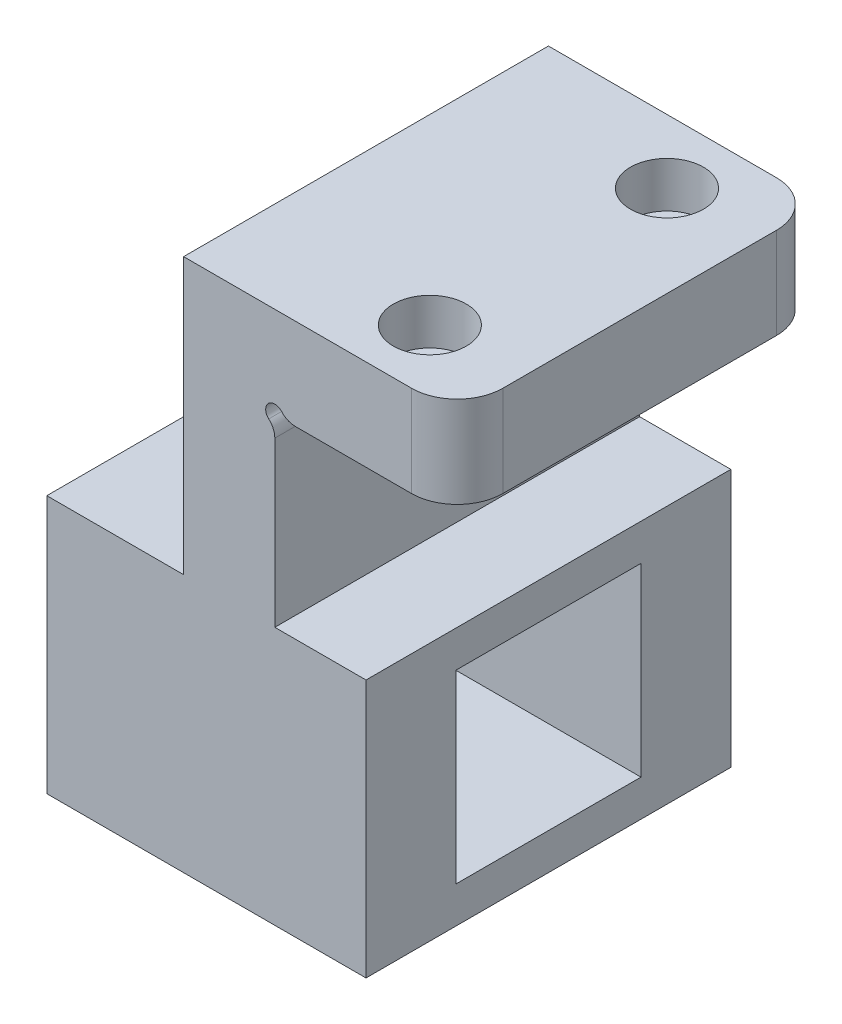
ISO-10303-21;
HEADER;
FILE_DESCRIPTION(('STEP AP214'),'2;1');
FILE_NAME('part.step','',(''),(''),'','','');
FILE_SCHEMA(('AUTOMOTIVE_DESIGN { 1 0 10303 214 1 1 1 1 }'));
ENDSEC;
DATA;
#1=APPLICATION_CONTEXT('core data for automotive mechanical design processes');
#2=APPLICATION_PROTOCOL_DEFINITION('international standard','automotive_design',2000,#1);
#3=PRODUCT_CONTEXT('',#1,'mechanical');
#4=PRODUCT('Part','Part','',(#3));
#5=PRODUCT_RELATED_PRODUCT_CATEGORY('part','',(#4));
#6=PRODUCT_DEFINITION_FORMATION('','',#4);
#7=PRODUCT_DEFINITION_CONTEXT('part definition',#1,'design');
#8=PRODUCT_DEFINITION('design','',#6,#7);
#9=PRODUCT_DEFINITION_SHAPE('','',#8);
#10=(LENGTH_UNIT() NAMED_UNIT(*) SI_UNIT(.MILLI.,.METRE.));
#11=(NAMED_UNIT(*) PLANE_ANGLE_UNIT() SI_UNIT($,.RADIAN.));
#12=(NAMED_UNIT(*) SI_UNIT($,.STERADIAN.) SOLID_ANGLE_UNIT());
#13=UNCERTAINTY_MEASURE_WITH_UNIT(LENGTH_MEASURE(1.E-05),#10,'distance_accuracy_value','');
#14=(GEOMETRIC_REPRESENTATION_CONTEXT(3) GLOBAL_UNCERTAINTY_ASSIGNED_CONTEXT((#13)) GLOBAL_UNIT_ASSIGNED_CONTEXT((#10,
#11,#12)) REPRESENTATION_CONTEXT('',''));
#15=CARTESIAN_POINT('',(0.,0.,0.));
#16=DIRECTION('',(0.,0.,1.));
#17=DIRECTION('',(1.,0.,0.));
#18=AXIS2_PLACEMENT_3D('',#15,#16,#17);
#19=CARTESIAN_POINT('',(0.,0.,40.));
#20=DIRECTION('',(-1.,0.,0.));
#21=DIRECTION('',(0.,0.,1.));
#22=AXIS2_PLACEMENT_3D('',#19,#20,#21);
#23=PLANE('',#22);
#24=CARTESIAN_POINT('',(0.,10.,20.));
#25=DIRECTION('',(-1.,0.,0.));
#26=DIRECTION('',(0.,-1.,0.));
#27=AXIS2_PLACEMENT_3D('',#24,#25,#26);
#28=CIRCLE('',#27,2.1);
#29=CARTESIAN_POINT('',(0.,7.9,20.));
#30=VERTEX_POINT('',#29);
#31=EDGE_CURVE('E327',#30,#30,#28,.T.);
#32=ORIENTED_EDGE('',*,*,#31,.T.);
#33=EDGE_LOOP('',(#32));
#34=FACE_BOUND('',#33,.T.);
#35=DIRECTION('',(0.,0.,1.));
#36=VECTOR('',#35,1.);
#37=CARTESIAN_POINT('',(0.,1.8,40.));
#38=LINE('',#37,#36);
#39=CARTESIAN_POINT('',(0.,1.8,0.));
#40=VERTEX_POINT('',#39);
#41=CARTESIAN_POINT('',(0.,1.8,40.));
#42=VERTEX_POINT('',#41);
#43=EDGE_CURVE('E300',#40,#42,#38,.T.);
#44=ORIENTED_EDGE('',*,*,#43,.F.);
#45=DIRECTION('',(0.,1.,0.));
#46=VECTOR('',#45,1.);
#47=CARTESIAN_POINT('',(0.,0.,0.));
#48=LINE('',#47,#46);
#49=CARTESIAN_POINT('',(0.,19.7639320225002,0.));
#50=VERTEX_POINT('',#49);
#51=EDGE_CURVE('E336',#40,#50,#48,.T.);
#52=ORIENTED_EDGE('',*,*,#51,.T.);
#53=DIRECTION('',(0.,0.,-1.));
#54=VECTOR('',#53,1.);
#55=CARTESIAN_POINT('',(0.,19.7639320225002,40.));
#56=LINE('',#55,#54);
#57=CARTESIAN_POINT('',(0.,19.7639320225002,40.));
#58=VERTEX_POINT('',#57);
#59=EDGE_CURVE('E388',#58,#50,#56,.T.);
#60=ORIENTED_EDGE('',*,*,#59,.F.);
#61=DIRECTION('',(0.,1.,0.));
#62=VECTOR('',#61,1.);
#63=CARTESIAN_POINT('',(0.,0.,40.));
#64=LINE('',#63,#62);
#65=EDGE_CURVE('E339',#42,#58,#64,.T.);
#66=ORIENTED_EDGE('',*,*,#65,.F.);
#67=EDGE_LOOP('',(#44,#52,#60,#66));
#68=FACE_BOUND('',#67,.T.);
#69=ADVANCED_FACE('F89',(#34,#68),#23,.F.);
#70=CARTESIAN_POINT('',(-10.,32.,40.));
#71=DIRECTION('',(1.,0.,0.));
#72=DIRECTION('',(0.,1.,0.));
#73=AXIS2_PLACEMENT_3D('',#70,#71,#72);
#74=PLANE('',#73);
#75=CARTESIAN_POINT('',(-10.,10.,20.));
#76=DIRECTION('',(-1.,0.,0.));
#77=DIRECTION('',(0.,-1.,0.));
#78=AXIS2_PLACEMENT_3D('',#75,#76,#77);
#79=CIRCLE('',#78,4.);
#80=CARTESIAN_POINT('',(-10.,6.,20.));
#81=VERTEX_POINT('',#80);
#82=EDGE_CURVE('E330',#81,#81,#79,.T.);
#83=ORIENTED_EDGE('',*,*,#82,.F.);
#84=EDGE_LOOP('',(#83));
#85=FACE_BOUND('',#84,.T.);
#86=DIRECTION('',(0.,0.,-1.));
#87=VECTOR('',#86,1.);
#88=CARTESIAN_POINT('',(-10.,1.8,40.));
#89=LINE('',#88,#87);
#90=CARTESIAN_POINT('',(-10.,1.8,40.));
#91=VERTEX_POINT('',#90);
#92=CARTESIAN_POINT('',(-10.,1.8,0.));
#93=VERTEX_POINT('',#92);
#94=EDGE_CURVE('E290',#91,#93,#89,.T.);
#95=ORIENTED_EDGE('',*,*,#94,.F.);
#96=DIRECTION('',(0.,-1.,0.));
#97=VECTOR('',#96,1.);
#98=CARTESIAN_POINT('',(-10.,32.,40.));
#99=LINE('',#98,#97);
#100=CARTESIAN_POINT('',(-10.,32.,40.));
#101=VERTEX_POINT('',#100);
#102=EDGE_CURVE('E354',#101,#91,#99,.T.);
#103=ORIENTED_EDGE('',*,*,#102,.F.);
#104=DIRECTION('',(0.,0.,-1.));
#105=VECTOR('',#104,1.);
#106=CARTESIAN_POINT('',(-10.,32.,40.));
#107=LINE('',#106,#105);
#108=CARTESIAN_POINT('',(-10.,32.,0.));
#109=VERTEX_POINT('',#108);
#110=EDGE_CURVE('E357',#101,#109,#107,.T.);
#111=ORIENTED_EDGE('',*,*,#110,.T.);
#112=DIRECTION('',(0.,-1.,0.));
#113=VECTOR('',#112,1.);
#114=CARTESIAN_POINT('',(-10.,32.,0.));
#115=LINE('',#114,#113);
#116=EDGE_CURVE('E342',#109,#93,#115,.T.);
#117=ORIENTED_EDGE('',*,*,#116,.T.);
#118=EDGE_LOOP('',(#95,#103,#111,#117));
#119=FACE_BOUND('',#118,.T.);
#120=ADVANCED_FACE('F420',(#85,#119),#74,.F.);
#121=CARTESIAN_POINT('',(-2.,19.7639320225002,40.));
#122=DIRECTION('',(0.,0.,-1.));
#123=DIRECTION('',(-1.,0.,0.));
#124=AXIS2_PLACEMENT_3D('',#121,#122,#123);
#125=CYLINDRICAL_SURFACE('',#124,2.);
#126=CARTESIAN_POINT('',(-2.,19.7639320225002,0.));
#127=DIRECTION('',(0.,0.,1.));
#128=DIRECTION('',(1.,0.,0.));
#129=AXIS2_PLACEMENT_3D('',#126,#127,#128);
#130=CIRCLE('',#129,2.);
#131=CARTESIAN_POINT('',(-0.666666666666667,21.2546440075001,0.));
#132=VERTEX_POINT('',#131);
#133=EDGE_CURVE('E359',#50,#132,#130,.T.);
#134=ORIENTED_EDGE('',*,*,#133,.T.);
#135=DIRECTION('',(0.,0.,-1.));
#136=VECTOR('',#135,1.);
#137=CARTESIAN_POINT('',(-0.666666666666667,21.2546440075001,40.));
#138=LINE('',#137,#136);
#139=CARTESIAN_POINT('',(-0.666666666666667,21.2546440075001,40.));
#140=VERTEX_POINT('',#139);
#141=EDGE_CURVE('E386',#140,#132,#138,.T.);
#142=ORIENTED_EDGE('',*,*,#141,.F.);
#143=CARTESIAN_POINT('',(-2.,19.7639320225002,40.));
#144=DIRECTION('',(0.,0.,1.));
#145=DIRECTION('',(1.,0.,0.));
#146=AXIS2_PLACEMENT_3D('',#143,#144,#145);
#147=CIRCLE('',#146,2.);
#148=EDGE_CURVE('E341',#58,#140,#147,.T.);
#149=ORIENTED_EDGE('',*,*,#148,.F.);
#150=ORIENTED_EDGE('',*,*,#59,.T.);
#151=EDGE_LOOP('',(#134,#142,#149,#150));
#152=FACE_BOUND('',#151,.T.);
#153=ADVANCED_FACE('F444',(#152),#125,.T.);
#154=CARTESIAN_POINT('',(0.,22.,40.));
#155=DIRECTION('',(0.,0.,-1.));
#156=DIRECTION('',(-1.,0.,0.));
#157=AXIS2_PLACEMENT_3D('',#154,#155,#156);
#158=CYLINDRICAL_SURFACE('',#157,0.999999999999999);
#159=CARTESIAN_POINT('',(0.,22.,0.));
#160=DIRECTION('',(0.,0.,1.));
#161=DIRECTION('',(1.,0.,0.));
#162=AXIS2_PLACEMENT_3D('',#159,#160,#161);
#163=CIRCLE('',#162,0.999999999999999);
#164=CARTESIAN_POINT('',(0.745355992499929,22.6666666666667,0.));
#165=VERTEX_POINT('',#164);
#166=EDGE_CURVE('E362',#165,#132,#163,.T.);
#167=ORIENTED_EDGE('',*,*,#166,.F.);
#168=DIRECTION('',(0.,0.,-1.));
#169=VECTOR('',#168,1.);
#170=CARTESIAN_POINT('',(0.745355992499929,22.6666666666667,40.));
#171=LINE('',#170,#169);
#172=CARTESIAN_POINT('',(0.745355992499929,22.6666666666667,40.));
#173=VERTEX_POINT('',#172);
#174=EDGE_CURVE('E384',#173,#165,#171,.T.);
#175=ORIENTED_EDGE('',*,*,#174,.F.);
#176=CARTESIAN_POINT('',(0.,22.,40.));
#177=DIRECTION('',(0.,0.,1.));
#178=DIRECTION('',(1.,0.,0.));
#179=AXIS2_PLACEMENT_3D('',#176,#177,#178);
#180=CIRCLE('',#179,0.999999999999999);
#181=EDGE_CURVE('E344',#173,#140,#180,.T.);
#182=ORIENTED_EDGE('',*,*,#181,.T.);
#183=ORIENTED_EDGE('',*,*,#141,.T.);
#184=EDGE_LOOP('',(#167,#175,#182,#183));
#185=FACE_BOUND('',#184,.T.);
#186=ADVANCED_FACE('F451',(#185),#158,.F.);
#187=CARTESIAN_POINT('',(2.23606797749979,24.,40.));
#188=DIRECTION('',(0.,0.,-1.));
#189=DIRECTION('',(-1.,0.,0.));
#190=AXIS2_PLACEMENT_3D('',#187,#188,#189);
#191=CYLINDRICAL_SURFACE('',#190,2.);
#192=CARTESIAN_POINT('',(2.23606797749979,24.,0.));
#193=DIRECTION('',(0.,0.,-1.));
#194=DIRECTION('',(-1.,0.,0.));
#195=AXIS2_PLACEMENT_3D('',#192,#193,#194);
#196=CIRCLE('',#195,2.);
#197=CARTESIAN_POINT('',(2.23606797749979,22.,0.));
#198=VERTEX_POINT('',#197);
#199=EDGE_CURVE('E365',#198,#165,#196,.T.);
#200=ORIENTED_EDGE('',*,*,#199,.F.);
#201=DIRECTION('',(0.,0.,-1.));
#202=VECTOR('',#201,1.);
#203=CARTESIAN_POINT('',(2.23606797749979,22.,40.));
#204=LINE('',#203,#202);
#205=CARTESIAN_POINT('',(2.23606797749979,22.,40.));
#206=VERTEX_POINT('',#205);
#207=EDGE_CURVE('E382',#206,#198,#204,.T.);
#208=ORIENTED_EDGE('',*,*,#207,.F.);
#209=CARTESIAN_POINT('',(2.23606797749979,24.,40.));
#210=DIRECTION('',(0.,0.,-1.));
#211=DIRECTION('',(-1.,0.,0.));
#212=AXIS2_PLACEMENT_3D('',#209,#210,#211);
#213=CIRCLE('',#212,2.);
#214=EDGE_CURVE('E347',#206,#173,#213,.T.);
#215=ORIENTED_EDGE('',*,*,#214,.T.);
#216=ORIENTED_EDGE('',*,*,#174,.T.);
#217=EDGE_LOOP('',(#200,#208,#215,#216));
#218=FACE_BOUND('',#217,.T.);
#219=ADVANCED_FACE('F455',(#218),#191,.T.);
#220=CARTESIAN_POINT('',(2.23606797749979,22.,40.));
#221=DIRECTION('',(0.,1.,0.));
#222=DIRECTION('',(0.,0.,1.));
#223=AXIS2_PLACEMENT_3D('',#220,#221,#222);
#224=PLANE('',#223);
#225=CARTESIAN_POINT('',(10.,22.,33.));
#226=DIRECTION('',(0.,1.,0.));
#227=DIRECTION('',(-1.,0.,0.));
#228=AXIS2_PLACEMENT_3D('',#225,#226,#227);
#229=CIRCLE('',#228,2.1);
#230=CARTESIAN_POINT('',(7.9,22.,33.));
#231=VERTEX_POINT('',#230);
#232=EDGE_CURVE('E303',#231,#231,#229,.T.);
#233=ORIENTED_EDGE('',*,*,#232,.T.);
#234=EDGE_LOOP('',(#233));
#235=FACE_BOUND('',#234,.T.);
#236=CARTESIAN_POINT('',(10.,22.,7.));
#237=DIRECTION('',(0.,1.,0.));
#238=DIRECTION('',(-1.,0.,0.));
#239=AXIS2_PLACEMENT_3D('',#236,#237,#238);
#240=CIRCLE('',#239,2.1);
#241=CARTESIAN_POINT('',(7.9,22.,7.));
#242=VERTEX_POINT('',#241);
#243=EDGE_CURVE('E310',#242,#242,#240,.T.);
#244=ORIENTED_EDGE('',*,*,#243,.T.);
#245=EDGE_LOOP('',(#244));
#246=FACE_BOUND('',#245,.T.);
#247=DIRECTION('',(1.,0.,0.));
#248=VECTOR('',#247,1.);
#249=CARTESIAN_POINT('',(2.23606797749979,22.,0.));
#250=LINE('',#249,#248);
#251=CARTESIAN_POINT('',(15.,22.,0.));
#252=VERTEX_POINT('',#251);
#253=EDGE_CURVE('E368',#198,#252,#250,.T.);
#254=ORIENTED_EDGE('',*,*,#253,.T.);
#255=CARTESIAN_POINT('',(15.,22.,5.));
#256=DIRECTION('',(0.,1.,0.));
#257=DIRECTION('',(0.,0.,1.));
#258=AXIS2_PLACEMENT_3D('',#255,#256,#257);
#259=CIRCLE('',#258,5.);
#260=CARTESIAN_POINT('',(20.,22.,5.));
#261=VERTEX_POINT('',#260);
#262=EDGE_CURVE('E97',#252,#261,#259,.F.);
#263=ORIENTED_EDGE('',*,*,#262,.T.);
#264=DIRECTION('',(0.,0.,-1.));
#265=VECTOR('',#264,1.);
#266=CARTESIAN_POINT('',(20.,22.,40.));
#267=LINE('',#266,#265);
#268=CARTESIAN_POINT('',(20.,22.,35.));
#269=VERTEX_POINT('',#268);
#270=EDGE_CURVE('E379',#269,#261,#267,.T.);
#271=ORIENTED_EDGE('',*,*,#270,.F.);
#272=CARTESIAN_POINT('',(15.,22.,35.));
#273=DIRECTION('',(0.,1.,0.));
#274=DIRECTION('',(0.,0.,1.));
#275=AXIS2_PLACEMENT_3D('',#272,#273,#274);
#276=CIRCLE('',#275,5.);
#277=CARTESIAN_POINT('',(15.,22.,40.));
#278=VERTEX_POINT('',#277);
#279=EDGE_CURVE('E104',#269,#278,#276,.F.);
#280=ORIENTED_EDGE('',*,*,#279,.T.);
#281=DIRECTION('',(1.,0.,0.));
#282=VECTOR('',#281,1.);
#283=CARTESIAN_POINT('',(2.23606797749979,22.,40.));
#284=LINE('',#283,#282);
#285=EDGE_CURVE('E350',#206,#278,#284,.T.);
#286=ORIENTED_EDGE('',*,*,#285,.F.);
#287=ORIENTED_EDGE('',*,*,#207,.T.);
#288=EDGE_LOOP('',(#254,#263,#271,#280,#286,#287));
#289=FACE_BOUND('',#288,.T.);
#290=ADVANCED_FACE('F402',(#235,#246,#289),#224,.F.);
#291=CARTESIAN_POINT('',(20.,22.,40.));
#292=DIRECTION('',(-1.,0.,0.));
#293=DIRECTION('',(0.,-1.,0.));
#294=AXIS2_PLACEMENT_3D('',#291,#292,#293);
#295=PLANE('',#294);
#296=ORIENTED_EDGE('',*,*,#270,.T.);
#297=DIRECTION('',(0.,1.,0.));
#298=VECTOR('',#297,1.);
#299=CARTESIAN_POINT('',(20.,22.,5.));
#300=LINE('',#299,#298);
#301=CARTESIAN_POINT('',(20.,32.,5.));
#302=VERTEX_POINT('',#301);
#303=EDGE_CURVE('E393',#261,#302,#300,.T.);
#304=ORIENTED_EDGE('',*,*,#303,.T.);
#305=DIRECTION('',(0.,0.,-1.));
#306=VECTOR('',#305,1.);
#307=CARTESIAN_POINT('',(20.,32.,40.));
#308=LINE('',#307,#306);
#309=CARTESIAN_POINT('',(20.,32.,35.));
#310=VERTEX_POINT('',#309);
#311=EDGE_CURVE('E376',#310,#302,#308,.T.);
#312=ORIENTED_EDGE('',*,*,#311,.F.);
#313=DIRECTION('',(0.,1.,0.));
#314=VECTOR('',#313,1.);
#315=CARTESIAN_POINT('',(20.,22.,35.));
#316=LINE('',#315,#314);
#317=EDGE_CURVE('E391',#310,#269,#316,.F.);
#318=ORIENTED_EDGE('',*,*,#317,.T.);
#319=EDGE_LOOP('',(#296,#304,#312,#318));
#320=FACE_BOUND('',#319,.T.);
#321=ADVANCED_FACE('F406',(#320),#295,.F.);
#322=CARTESIAN_POINT('',(20.,32.,40.));
#323=DIRECTION('',(0.,-1.,0.));
#324=DIRECTION('',(1.,0.,0.));
#325=AXIS2_PLACEMENT_3D('',#322,#323,#324);
#326=PLANE('',#325);
#327=CARTESIAN_POINT('',(10.,32.,33.));
#328=DIRECTION('',(0.,1.,0.));
#329=DIRECTION('',(-1.,0.,0.));
#330=AXIS2_PLACEMENT_3D('',#327,#328,#329);
#331=CIRCLE('',#330,4.);
#332=CARTESIAN_POINT('',(5.99999999999999,32.,33.));
#333=VERTEX_POINT('',#332);
#334=EDGE_CURVE('E319',#333,#333,#331,.T.);
#335=ORIENTED_EDGE('',*,*,#334,.F.);
#336=EDGE_LOOP('',(#335));
#337=FACE_BOUND('',#336,.T.);
#338=CARTESIAN_POINT('',(10.,32.,7.));
#339=DIRECTION('',(0.,1.,0.));
#340=DIRECTION('',(-1.,0.,0.));
#341=AXIS2_PLACEMENT_3D('',#338,#339,#340);
#342=CIRCLE('',#341,4.);
#343=CARTESIAN_POINT('',(6.,32.,7.));
#344=VERTEX_POINT('',#343);
#345=EDGE_CURVE('E306',#344,#344,#342,.T.);
#346=ORIENTED_EDGE('',*,*,#345,.F.);
#347=EDGE_LOOP('',(#346));
#348=FACE_BOUND('',#347,.T.);
#349=ORIENTED_EDGE('',*,*,#311,.T.);
#350=CARTESIAN_POINT('',(15.,32.,5.));
#351=DIRECTION('',(0.,-1.,0.));
#352=DIRECTION('',(1.,0.,0.));
#353=AXIS2_PLACEMENT_3D('',#350,#351,#352);
#354=CIRCLE('',#353,5.);
#355=CARTESIAN_POINT('',(15.,32.,0.));
#356=VERTEX_POINT('',#355);
#357=EDGE_CURVE('E398',#302,#356,#354,.F.);
#358=ORIENTED_EDGE('',*,*,#357,.T.);
#359=DIRECTION('',(-1.,0.,0.));
#360=VECTOR('',#359,1.);
#361=CARTESIAN_POINT('',(20.,32.,0.));
#362=LINE('',#361,#360);
#363=EDGE_CURVE('E370',#356,#109,#362,.T.);
#364=ORIENTED_EDGE('',*,*,#363,.T.);
#365=ORIENTED_EDGE('',*,*,#110,.F.);
#366=DIRECTION('',(-1.,0.,0.));
#367=VECTOR('',#366,1.);
#368=CARTESIAN_POINT('',(20.,32.,40.));
#369=LINE('',#368,#367);
#370=CARTESIAN_POINT('',(15.,32.,40.));
#371=VERTEX_POINT('',#370);
#372=EDGE_CURVE('E352',#371,#101,#369,.T.);
#373=ORIENTED_EDGE('',*,*,#372,.F.);
#374=CARTESIAN_POINT('',(15.,32.,35.));
#375=DIRECTION('',(0.,-1.,0.));
#376=DIRECTION('',(1.,0.,0.));
#377=AXIS2_PLACEMENT_3D('',#374,#375,#376);
#378=CIRCLE('',#377,5.);
#379=EDGE_CURVE('E396',#371,#310,#378,.F.);
#380=ORIENTED_EDGE('',*,*,#379,.T.);
#381=EDGE_LOOP('',(#349,#358,#364,#365,#373,#380));
#382=FACE_BOUND('',#381,.T.);
#383=ADVANCED_FACE('F411',(#337,#348,#382),#326,.F.);
#384=CARTESIAN_POINT('',(-2.,19.7639320225002,40.));
#385=DIRECTION('',(0.,0.,1.));
#386=DIRECTION('',(1.,0.,0.));
#387=AXIS2_PLACEMENT_3D('',#384,#385,#386);
#388=PLANE('',#387);
#389=DIRECTION('',(-1.,0.,0.));
#390=VECTOR('',#389,1.);
#391=CARTESIAN_POINT('',(10.0001,1.8,40.));
#392=LINE('',#391,#390);
#393=CARTESIAN_POINT('',(10.0001,1.8,40.));
#394=VERTEX_POINT('',#393);
#395=EDGE_CURVE('E292',#394,#42,#392,.T.);
#396=ORIENTED_EDGE('',*,*,#395,.T.);
#397=ORIENTED_EDGE('',*,*,#65,.T.);
#398=ORIENTED_EDGE('',*,*,#148,.T.);
#399=ORIENTED_EDGE('',*,*,#181,.F.);
#400=ORIENTED_EDGE('',*,*,#214,.F.);
#401=ORIENTED_EDGE('',*,*,#285,.T.);
#402=DIRECTION('',(0.,1.,0.));
#403=VECTOR('',#402,1.);
#404=CARTESIAN_POINT('',(15.,32.,40.));
#405=LINE('',#404,#403);
#406=EDGE_CURVE('E12',#278,#371,#405,.T.);
#407=ORIENTED_EDGE('',*,*,#406,.T.);
#408=ORIENTED_EDGE('',*,*,#372,.T.);
#409=ORIENTED_EDGE('',*,*,#102,.T.);
#410=CARTESIAN_POINT('',(-25.,1.8,40.));
#411=VERTEX_POINT('',#410);
#412=EDGE_CURVE('E295',#91,#411,#392,.T.);
#413=ORIENTED_EDGE('',*,*,#412,.T.);
#414=DIRECTION('',(0.,-1.,0.));
#415=VECTOR('',#414,1.);
#416=CARTESIAN_POINT('',(-25.,1.8,40.));
#417=LINE('',#416,#415);
#418=CARTESIAN_POINT('',(-25.,-26.5,40.));
#419=VERTEX_POINT('',#418);
#420=EDGE_CURVE('E260',#411,#419,#417,.T.);
#421=ORIENTED_EDGE('',*,*,#420,.T.);
#422=DIRECTION('',(-1.,0.,0.));
#423=VECTOR('',#422,1.);
#424=CARTESIAN_POINT('',(10.0001,-26.5,40.));
#425=LINE('',#424,#423);
#426=CARTESIAN_POINT('',(10.0001,-26.5,40.));
#427=VERTEX_POINT('',#426);
#428=EDGE_CURVE('E296',#427,#419,#425,.T.);
#429=ORIENTED_EDGE('',*,*,#428,.F.);
#430=DIRECTION('',(0.,-1.,0.));
#431=VECTOR('',#430,1.);
#432=CARTESIAN_POINT('',(10.0001,1.8,40.));
#433=LINE('',#432,#431);
#434=EDGE_CURVE('E283',#394,#427,#433,.T.);
#435=ORIENTED_EDGE('',*,*,#434,.F.);
#436=EDGE_LOOP('',(#396,#397,#398,#399,#400,#401,#407,#408,#409,#413,#421,#429,#435));
#437=FACE_BOUND('',#436,.T.);
#438=ADVANCED_FACE('F424',(#437),#388,.T.);
#439=CARTESIAN_POINT('',(-2.,19.7639320225002,0.));
#440=DIRECTION('',(0.,0.,1.));
#441=DIRECTION('',(1.,0.,0.));
#442=AXIS2_PLACEMENT_3D('',#439,#440,#441);
#443=PLANE('',#442);
#444=ORIENTED_EDGE('',*,*,#51,.F.);
#445=DIRECTION('',(-1.,0.,0.));
#446=VECTOR('',#445,1.);
#447=CARTESIAN_POINT('',(10.0001,1.8,0.));
#448=LINE('',#447,#446);
#449=CARTESIAN_POINT('',(10.0001,1.8,0.));
#450=VERTEX_POINT('',#449);
#451=EDGE_CURVE('E288',#450,#40,#448,.T.);
#452=ORIENTED_EDGE('',*,*,#451,.F.);
#453=DIRECTION('',(0.,-1.,0.));
#454=VECTOR('',#453,1.);
#455=CARTESIAN_POINT('',(10.0001,1.8,0.));
#456=LINE('',#455,#454);
#457=CARTESIAN_POINT('',(10.0001,-26.5,0.));
#458=VERTEX_POINT('',#457);
#459=EDGE_CURVE('E274',#450,#458,#456,.T.);
#460=ORIENTED_EDGE('',*,*,#459,.T.);
#461=DIRECTION('',(-1.,0.,0.));
#462=VECTOR('',#461,1.);
#463=CARTESIAN_POINT('',(10.0001,-26.5,0.));
#464=LINE('',#463,#462);
#465=CARTESIAN_POINT('',(-25.,-26.5,0.));
#466=VERTEX_POINT('',#465);
#467=EDGE_CURVE('E287',#458,#466,#464,.T.);
#468=ORIENTED_EDGE('',*,*,#467,.T.);
#469=DIRECTION('',(0.,-1.,0.));
#470=VECTOR('',#469,1.);
#471=CARTESIAN_POINT('',(-25.,1.79999999999999,0.));
#472=LINE('',#471,#470);
#473=CARTESIAN_POINT('',(-25.,1.79999999999999,0.));
#474=VERTEX_POINT('',#473);
#475=EDGE_CURVE('E254',#474,#466,#472,.T.);
#476=ORIENTED_EDGE('',*,*,#475,.F.);
#477=EDGE_CURVE('E291',#93,#474,#448,.T.);
#478=ORIENTED_EDGE('',*,*,#477,.F.);
#479=ORIENTED_EDGE('',*,*,#116,.F.);
#480=ORIENTED_EDGE('',*,*,#363,.F.);
#481=DIRECTION('',(0.,1.,0.));
#482=VECTOR('',#481,1.);
#483=CARTESIAN_POINT('',(15.,19.7639320225002,0.));
#484=LINE('',#483,#482);
#485=EDGE_CURVE('E112',#356,#252,#484,.F.);
#486=ORIENTED_EDGE('',*,*,#485,.T.);
#487=ORIENTED_EDGE('',*,*,#253,.F.);
#488=ORIENTED_EDGE('',*,*,#199,.T.);
#489=ORIENTED_EDGE('',*,*,#166,.T.);
#490=ORIENTED_EDGE('',*,*,#133,.F.);
#491=EDGE_LOOP('',(#444,#452,#460,#468,#476,#478,#479,#480,#486,#487,#488,#489,#490));
#492=FACE_BOUND('',#491,.T.);
#493=ADVANCED_FACE('F415',(#492),#443,.F.);
#494=CARTESIAN_POINT('',(-5.,10.,20.));
#495=DIRECTION('',(-1.,0.,0.));
#496=DIRECTION('',(0.,-1.,0.));
#497=AXIS2_PLACEMENT_3D('',#494,#495,#496);
#498=CYLINDRICAL_SURFACE('',#497,4.);
#499=CARTESIAN_POINT('',(-5.,10.,20.));
#500=DIRECTION('',(-1.,0.,0.));
#501=DIRECTION('',(0.,-1.,0.));
#502=AXIS2_PLACEMENT_3D('',#499,#500,#501);
#503=CIRCLE('',#502,4.);
#504=CARTESIAN_POINT('',(-5.,6.,20.));
#505=VERTEX_POINT('',#504);
#506=EDGE_CURVE('E333',#505,#505,#503,.T.);
#507=ORIENTED_EDGE('',*,*,#506,.F.);
#508=EDGE_LOOP('',(#507));
#509=FACE_BOUND('',#508,.T.);
#510=ORIENTED_EDGE('',*,*,#82,.T.);
#511=EDGE_LOOP('',(#510));
#512=FACE_BOUND('',#511,.T.);
#513=ADVANCED_FACE('F470',(#509,#512),#498,.F.);
#514=CARTESIAN_POINT('',(-5.,0.,0.));
#515=DIRECTION('',(-1.,0.,0.));
#516=DIRECTION('',(0.,-1.,0.));
#517=AXIS2_PLACEMENT_3D('',#514,#515,#516);
#518=PLANE('',#517);
#519=CARTESIAN_POINT('',(-5.,10.,20.));
#520=DIRECTION('',(-1.,0.,0.));
#521=DIRECTION('',(0.,-1.,0.));
#522=AXIS2_PLACEMENT_3D('',#519,#520,#521);
#523=CIRCLE('',#522,2.1);
#524=CARTESIAN_POINT('',(-5.,7.9,20.));
#525=VERTEX_POINT('',#524);
#526=EDGE_CURVE('E318',#525,#525,#523,.T.);
#527=ORIENTED_EDGE('',*,*,#526,.F.);
#528=EDGE_LOOP('',(#527));
#529=FACE_BOUND('',#528,.T.);
#530=ORIENTED_EDGE('',*,*,#506,.T.);
#531=EDGE_LOOP('',(#530));
#532=FACE_BOUND('',#531,.T.);
#533=ADVANCED_FACE('F475',(#529,#532),#518,.T.);
#534=CARTESIAN_POINT('',(0.,10.,20.));
#535=DIRECTION('',(-1.,0.,0.));
#536=DIRECTION('',(0.,-1.,0.));
#537=AXIS2_PLACEMENT_3D('',#534,#535,#536);
#538=CYLINDRICAL_SURFACE('',#537,2.1);
#539=ORIENTED_EDGE('',*,*,#31,.F.);
#540=EDGE_LOOP('',(#539));
#541=FACE_BOUND('',#540,.T.);
#542=ORIENTED_EDGE('',*,*,#526,.T.);
#543=EDGE_LOOP('',(#542));
#544=FACE_BOUND('',#543,.T.);
#545=ADVANCED_FACE('F479',(#541,#544),#538,.F.);
#546=CARTESIAN_POINT('',(10.,27.,7.));
#547=DIRECTION('',(0.,1.,0.));
#548=DIRECTION('',(-1.,0.,0.));
#549=AXIS2_PLACEMENT_3D('',#546,#547,#548);
#550=CYLINDRICAL_SURFACE('',#549,4.);
#551=CARTESIAN_POINT('',(10.,27.,7.));
#552=DIRECTION('',(0.,1.,0.));
#553=DIRECTION('',(-1.,0.,0.));
#554=AXIS2_PLACEMENT_3D('',#551,#552,#553);
#555=CIRCLE('',#554,4.);
#556=CARTESIAN_POINT('',(6.,27.,7.));
#557=VERTEX_POINT('',#556);
#558=EDGE_CURVE('E322',#557,#557,#555,.T.);
#559=ORIENTED_EDGE('',*,*,#558,.F.);
#560=EDGE_LOOP('',(#559));
#561=FACE_BOUND('',#560,.T.);
#562=ORIENTED_EDGE('',*,*,#345,.T.);
#563=EDGE_LOOP('',(#562));
#564=FACE_BOUND('',#563,.T.);
#565=ADVANCED_FACE('F483',(#561,#564),#550,.F.);
#566=CARTESIAN_POINT('',(0.,27.,0.));
#567=DIRECTION('',(0.,1.,0.));
#568=DIRECTION('',(-1.,0.,0.));
#569=AXIS2_PLACEMENT_3D('',#566,#567,#568);
#570=PLANE('',#569);
#571=CARTESIAN_POINT('',(10.,27.,7.));
#572=DIRECTION('',(0.,1.,0.));
#573=DIRECTION('',(-1.,0.,0.));
#574=AXIS2_PLACEMENT_3D('',#571,#572,#573);
#575=CIRCLE('',#574,2.1);
#576=CARTESIAN_POINT('',(7.9,27.,7.));
#577=VERTEX_POINT('',#576);
#578=EDGE_CURVE('E302',#577,#577,#575,.T.);
#579=ORIENTED_EDGE('',*,*,#578,.F.);
#580=EDGE_LOOP('',(#579));
#581=FACE_BOUND('',#580,.T.);
#582=ORIENTED_EDGE('',*,*,#558,.T.);
#583=EDGE_LOOP('',(#582));
#584=FACE_BOUND('',#583,.T.);
#585=ADVANCED_FACE('F487',(#581,#584),#570,.T.);
#586=CARTESIAN_POINT('',(10.,27.,33.));
#587=DIRECTION('',(0.,1.,0.));
#588=DIRECTION('',(-1.,0.,0.));
#589=AXIS2_PLACEMENT_3D('',#586,#587,#588);
#590=CYLINDRICAL_SURFACE('',#589,4.);
#591=CARTESIAN_POINT('',(10.,27.,33.));
#592=DIRECTION('',(0.,1.,0.));
#593=DIRECTION('',(-1.,0.,0.));
#594=AXIS2_PLACEMENT_3D('',#591,#592,#593);
#595=CIRCLE('',#594,4.);
#596=CARTESIAN_POINT('',(5.99999999999999,27.,33.));
#597=VERTEX_POINT('',#596);
#598=EDGE_CURVE('E315',#597,#597,#595,.T.);
#599=ORIENTED_EDGE('',*,*,#598,.F.);
#600=EDGE_LOOP('',(#599));
#601=FACE_BOUND('',#600,.T.);
#602=ORIENTED_EDGE('',*,*,#334,.T.);
#603=EDGE_LOOP('',(#602));
#604=FACE_BOUND('',#603,.T.);
#605=ADVANCED_FACE('F491',(#601,#604),#590,.F.);
#606=CARTESIAN_POINT('',(0.,27.,0.));
#607=DIRECTION('',(0.,1.,0.));
#608=DIRECTION('',(-1.,0.,0.));
#609=AXIS2_PLACEMENT_3D('',#606,#607,#608);
#610=PLANE('',#609);
#611=CARTESIAN_POINT('',(10.,27.,33.));
#612=DIRECTION('',(0.,1.,0.));
#613=DIRECTION('',(-1.,0.,0.));
#614=AXIS2_PLACEMENT_3D('',#611,#612,#613);
#615=CIRCLE('',#614,2.1);
#616=CARTESIAN_POINT('',(7.9,27.,33.));
#617=VERTEX_POINT('',#616);
#618=EDGE_CURVE('E307',#617,#617,#615,.T.);
#619=ORIENTED_EDGE('',*,*,#618,.F.);
#620=EDGE_LOOP('',(#619));
#621=FACE_BOUND('',#620,.T.);
#622=ORIENTED_EDGE('',*,*,#598,.T.);
#623=EDGE_LOOP('',(#622));
#624=FACE_BOUND('',#623,.T.);
#625=ADVANCED_FACE('F495',(#621,#624),#610,.T.);
#626=CARTESIAN_POINT('',(10.,22.,7.));
#627=DIRECTION('',(0.,1.,0.));
#628=DIRECTION('',(-1.,0.,0.));
#629=AXIS2_PLACEMENT_3D('',#626,#627,#628);
#630=CYLINDRICAL_SURFACE('',#629,2.1);
#631=ORIENTED_EDGE('',*,*,#243,.F.);
#632=EDGE_LOOP('',(#631));
#633=FACE_BOUND('',#632,.T.);
#634=ORIENTED_EDGE('',*,*,#578,.T.);
#635=EDGE_LOOP('',(#634));
#636=FACE_BOUND('',#635,.T.);
#637=ADVANCED_FACE('F499',(#633,#636),#630,.F.);
#638=CARTESIAN_POINT('',(10.,22.,33.));
#639=DIRECTION('',(0.,1.,0.));
#640=DIRECTION('',(-1.,0.,0.));
#641=AXIS2_PLACEMENT_3D('',#638,#639,#640);
#642=CYLINDRICAL_SURFACE('',#641,2.1);
#643=ORIENTED_EDGE('',*,*,#232,.F.);
#644=EDGE_LOOP('',(#643));
#645=FACE_BOUND('',#644,.T.);
#646=ORIENTED_EDGE('',*,*,#618,.T.);
#647=EDGE_LOOP('',(#646));
#648=FACE_BOUND('',#647,.T.);
#649=ADVANCED_FACE('F438',(#645,#648),#642,.F.);
#650=CARTESIAN_POINT('',(15.,22.,5.));
#651=DIRECTION('',(0.,1.,0.));
#652=DIRECTION('',(-1.,0.,0.));
#653=AXIS2_PLACEMENT_3D('',#650,#651,#652);
#654=CYLINDRICAL_SURFACE('',#653,5.);
#655=ORIENTED_EDGE('',*,*,#262,.F.);
#656=ORIENTED_EDGE('',*,*,#485,.F.);
#657=ORIENTED_EDGE('',*,*,#357,.F.);
#658=ORIENTED_EDGE('',*,*,#303,.F.);
#659=EDGE_LOOP('',(#655,#656,#657,#658));
#660=FACE_BOUND('',#659,.T.);
#661=ADVANCED_FACE('F409',(#660),#654,.T.);
#662=CARTESIAN_POINT('',(15.,19.7639320225002,35.));
#663=DIRECTION('',(0.,-1.,0.));
#664=DIRECTION('',(1.,0.,0.));
#665=AXIS2_PLACEMENT_3D('',#662,#663,#664);
#666=CYLINDRICAL_SURFACE('',#665,5.);
#667=ORIENTED_EDGE('',*,*,#279,.F.);
#668=ORIENTED_EDGE('',*,*,#317,.F.);
#669=ORIENTED_EDGE('',*,*,#379,.F.);
#670=ORIENTED_EDGE('',*,*,#406,.F.);
#671=EDGE_LOOP('',(#667,#668,#669,#670));
#672=FACE_BOUND('',#671,.T.);
#673=ADVANCED_FACE('F91',(#672),#666,.T.);
#674=CARTESIAN_POINT('',(10.0001,1.8,0.));
#675=DIRECTION('',(0.,-1.,0.));
#676=DIRECTION('',(1.,0.,0.));
#677=AXIS2_PLACEMENT_3D('',#674,#675,#676);
#678=PLANE('',#677);
#679=ORIENTED_EDGE('',*,*,#451,.T.);
#680=ORIENTED_EDGE('',*,*,#43,.T.);
#681=ORIENTED_EDGE('',*,*,#395,.F.);
#682=DIRECTION('',(0.,0.,1.));
#683=VECTOR('',#682,1.);
#684=CARTESIAN_POINT('',(10.0001,1.8,0.));
#685=LINE('',#684,#683);
#686=EDGE_CURVE('E285',#450,#394,#685,.T.);
#687=ORIENTED_EDGE('',*,*,#686,.F.);
#688=EDGE_LOOP('',(#679,#680,#681,#687));
#689=FACE_BOUND('',#688,.T.);
#690=ADVANCED_FACE('F429',(#689),#678,.F.);
#691=ORIENTED_EDGE('',*,*,#412,.F.);
#692=ORIENTED_EDGE('',*,*,#94,.T.);
#693=ORIENTED_EDGE('',*,*,#477,.T.);
#694=DIRECTION('',(0.,0.,1.));
#695=VECTOR('',#694,1.);
#696=CARTESIAN_POINT('',(-25.,1.79999999999999,0.));
#697=LINE('',#696,#695);
#698=EDGE_CURVE('E263',#474,#411,#697,.T.);
#699=ORIENTED_EDGE('',*,*,#698,.T.);
#700=EDGE_LOOP('',(#691,#692,#693,#699));
#701=FACE_BOUND('',#700,.T.);
#702=ADVANCED_FACE('F435',(#701),#678,.F.);
#703=CARTESIAN_POINT('',(10.0001,-26.5,0.));
#704=DIRECTION('',(0.,-1.,0.));
#705=DIRECTION('',(1.,0.,0.));
#706=AXIS2_PLACEMENT_3D('',#703,#704,#705);
#707=PLANE('',#706);
#708=ORIENTED_EDGE('',*,*,#428,.T.);
#709=DIRECTION('',(0.,0.,1.));
#710=VECTOR('',#709,1.);
#711=CARTESIAN_POINT('',(-25.,-26.5,0.));
#712=LINE('',#711,#710);
#713=EDGE_CURVE('E257',#466,#419,#712,.T.);
#714=ORIENTED_EDGE('',*,*,#713,.F.);
#715=ORIENTED_EDGE('',*,*,#467,.F.);
#716=DIRECTION('',(0.,0.,1.));
#717=VECTOR('',#716,1.);
#718=CARTESIAN_POINT('',(10.0001,-26.5,0.));
#719=LINE('',#718,#717);
#720=EDGE_CURVE('E280',#458,#427,#719,.T.);
#721=ORIENTED_EDGE('',*,*,#720,.T.);
#722=EDGE_LOOP('',(#708,#714,#715,#721));
#723=FACE_BOUND('',#722,.T.);
#724=ADVANCED_FACE('F507',(#723),#707,.T.);
#725=CARTESIAN_POINT('',(10.0001,0.,0.));
#726=DIRECTION('',(-1.,0.,0.));
#727=DIRECTION('',(0.,-1.,0.));
#728=AXIS2_PLACEMENT_3D('',#725,#726,#727);
#729=PLANE('',#728);
#730=DIRECTION('',(0.,0.,1.));
#731=VECTOR('',#730,1.);
#732=CARTESIAN_POINT('',(10.0001,-2.20000000000001,9.85));
#733=LINE('',#732,#731);
#734=CARTESIAN_POINT('',(10.0001,-2.20000000000001,9.85));
#735=VERTEX_POINT('',#734);
#736=CARTESIAN_POINT('',(10.0001,-2.2,30.15));
#737=VERTEX_POINT('',#736);
#738=EDGE_CURVE('E236',#735,#737,#733,.T.);
#739=ORIENTED_EDGE('',*,*,#738,.F.);
#740=DIRECTION('',(0.,-1.,0.));
#741=VECTOR('',#740,1.);
#742=CARTESIAN_POINT('',(10.0001,-2.20000000000001,9.85));
#743=LINE('',#742,#741);
#744=CARTESIAN_POINT('',(10.0001,-22.5,9.85));
#745=VERTEX_POINT('',#744);
#746=EDGE_CURVE('E266',#735,#745,#743,.T.);
#747=ORIENTED_EDGE('',*,*,#746,.T.);
#748=DIRECTION('',(0.,0.,1.));
#749=VECTOR('',#748,1.);
#750=CARTESIAN_POINT('',(10.0001,-22.5,9.85));
#751=LINE('',#750,#749);
#752=CARTESIAN_POINT('',(10.0001,-22.5,30.15));
#753=VERTEX_POINT('',#752);
#754=EDGE_CURVE('E231',#745,#753,#751,.T.);
#755=ORIENTED_EDGE('',*,*,#754,.T.);
#756=DIRECTION('',(0.,-1.,0.));
#757=VECTOR('',#756,1.);
#758=CARTESIAN_POINT('',(10.0001,-2.2,30.15));
#759=LINE('',#758,#757);
#760=EDGE_CURVE('E269',#737,#753,#759,.T.);
#761=ORIENTED_EDGE('',*,*,#760,.F.);
#762=EDGE_LOOP('',(#739,#747,#755,#761));
#763=FACE_BOUND('',#762,.T.);
#764=ORIENTED_EDGE('',*,*,#459,.F.);
#765=ORIENTED_EDGE('',*,*,#686,.T.);
#766=ORIENTED_EDGE('',*,*,#434,.T.);
#767=ORIENTED_EDGE('',*,*,#720,.F.);
#768=EDGE_LOOP('',(#764,#765,#766,#767));
#769=FACE_BOUND('',#768,.T.);
#770=ADVANCED_FACE('F509',(#763,#769),#729,.F.);
#771=CARTESIAN_POINT('',(10.0001,-2.20000000000001,9.85));
#772=DIRECTION('',(0.,0.,-1.));
#773=DIRECTION('',(-1.,0.,0.));
#774=AXIS2_PLACEMENT_3D('',#771,#772,#773);
#775=PLANE('',#774);
#776=DIRECTION('',(-1.,0.,0.));
#777=VECTOR('',#776,1.);
#778=CARTESIAN_POINT('',(10.0001,-2.20000000000001,9.85));
#779=LINE('',#778,#777);
#780=CARTESIAN_POINT('',(-25.,-2.20000000000001,9.85));
#781=VERTEX_POINT('',#780);
#782=EDGE_CURVE('E241',#735,#781,#779,.T.);
#783=ORIENTED_EDGE('',*,*,#782,.T.);
#784=DIRECTION('',(0.,-1.,0.));
#785=VECTOR('',#784,1.);
#786=CARTESIAN_POINT('',(-25.,-2.20000000000001,9.85));
#787=LINE('',#786,#785);
#788=CARTESIAN_POINT('',(-25.,-22.5,9.85));
#789=VERTEX_POINT('',#788);
#790=EDGE_CURVE('E239',#781,#789,#787,.T.);
#791=ORIENTED_EDGE('',*,*,#790,.T.);
#792=DIRECTION('',(-1.,0.,0.));
#793=VECTOR('',#792,1.);
#794=CARTESIAN_POINT('',(10.0001,-22.5,9.85));
#795=LINE('',#794,#793);
#796=EDGE_CURVE('E224',#745,#789,#795,.T.);
#797=ORIENTED_EDGE('',*,*,#796,.F.);
#798=ORIENTED_EDGE('',*,*,#746,.F.);
#799=EDGE_LOOP('',(#783,#791,#797,#798));
#800=FACE_BOUND('',#799,.T.);
#801=ADVANCED_FACE('F240',(#800),#775,.F.);
#802=CARTESIAN_POINT('',(10.0001,-2.20000000000001,9.85));
#803=DIRECTION('',(0.,-1.,0.));
#804=DIRECTION('',(1.,0.,0.));
#805=AXIS2_PLACEMENT_3D('',#802,#803,#804);
#806=PLANE('',#805);
#807=DIRECTION('',(-1.,0.,0.));
#808=VECTOR('',#807,1.);
#809=CARTESIAN_POINT('',(10.0001,-2.2,30.15));
#810=LINE('',#809,#808);
#811=CARTESIAN_POINT('',(-25.,-2.20000000000001,30.15));
#812=VERTEX_POINT('',#811);
#813=EDGE_CURVE('E275',#737,#812,#810,.T.);
#814=ORIENTED_EDGE('',*,*,#813,.T.);
#815=DIRECTION('',(0.,0.,1.));
#816=VECTOR('',#815,1.);
#817=CARTESIAN_POINT('',(-25.,-2.20000000000001,9.85));
#818=LINE('',#817,#816);
#819=EDGE_CURVE('E250',#781,#812,#818,.T.);
#820=ORIENTED_EDGE('',*,*,#819,.F.);
#821=ORIENTED_EDGE('',*,*,#782,.F.);
#822=ORIENTED_EDGE('',*,*,#738,.T.);
#823=EDGE_LOOP('',(#814,#820,#821,#822));
#824=FACE_BOUND('',#823,.T.);
#825=ADVANCED_FACE('F517',(#824),#806,.T.);
#826=CARTESIAN_POINT('',(10.0001,-2.2,30.15));
#827=DIRECTION('',(0.,0.,-1.));
#828=DIRECTION('',(0.,1.,0.));
#829=AXIS2_PLACEMENT_3D('',#826,#827,#828);
#830=PLANE('',#829);
#831=DIRECTION('',(-1.,0.,0.));
#832=VECTOR('',#831,1.);
#833=CARTESIAN_POINT('',(10.0001,-22.5,30.15));
#834=LINE('',#833,#832);
#835=CARTESIAN_POINT('',(-25.,-22.5,30.15));
#836=VERTEX_POINT('',#835);
#837=EDGE_CURVE('E235',#753,#836,#834,.T.);
#838=ORIENTED_EDGE('',*,*,#837,.T.);
#839=DIRECTION('',(0.,-1.,0.));
#840=VECTOR('',#839,1.);
#841=CARTESIAN_POINT('',(-25.,-2.20000000000001,30.15));
#842=LINE('',#841,#840);
#843=EDGE_CURVE('E248',#812,#836,#842,.T.);
#844=ORIENTED_EDGE('',*,*,#843,.F.);
#845=ORIENTED_EDGE('',*,*,#813,.F.);
#846=ORIENTED_EDGE('',*,*,#760,.T.);
#847=EDGE_LOOP('',(#838,#844,#845,#846));
#848=FACE_BOUND('',#847,.T.);
#849=ADVANCED_FACE('F520',(#848),#830,.T.);
#850=CARTESIAN_POINT('',(10.0001,-22.5,9.85));
#851=DIRECTION('',(0.,-1.,0.));
#852=DIRECTION('',(1.,0.,0.));
#853=AXIS2_PLACEMENT_3D('',#850,#851,#852);
#854=PLANE('',#853);
#855=ORIENTED_EDGE('',*,*,#796,.T.);
#856=DIRECTION('',(0.,0.,1.));
#857=VECTOR('',#856,1.);
#858=CARTESIAN_POINT('',(-25.,-22.5,9.85));
#859=LINE('',#858,#857);
#860=EDGE_CURVE('E228',#789,#836,#859,.T.);
#861=ORIENTED_EDGE('',*,*,#860,.T.);
#862=ORIENTED_EDGE('',*,*,#837,.F.);
#863=ORIENTED_EDGE('',*,*,#754,.F.);
#864=EDGE_LOOP('',(#855,#861,#862,#863));
#865=FACE_BOUND('',#864,.T.);
#866=ADVANCED_FACE('F226',(#865),#854,.F.);
#867=CARTESIAN_POINT('',(-25.,0.,0.));
#868=DIRECTION('',(-1.,0.,0.));
#869=DIRECTION('',(0.,-1.,0.));
#870=AXIS2_PLACEMENT_3D('',#867,#868,#869);
#871=PLANE('',#870);
#872=ORIENTED_EDGE('',*,*,#475,.T.);
#873=ORIENTED_EDGE('',*,*,#713,.T.);
#874=ORIENTED_EDGE('',*,*,#420,.F.);
#875=ORIENTED_EDGE('',*,*,#698,.F.);
#876=EDGE_LOOP('',(#872,#873,#874,#875));
#877=FACE_BOUND('',#876,.T.);
#878=ORIENTED_EDGE('',*,*,#860,.F.);
#879=ORIENTED_EDGE('',*,*,#790,.F.);
#880=ORIENTED_EDGE('',*,*,#819,.T.);
#881=ORIENTED_EDGE('',*,*,#843,.T.);
#882=EDGE_LOOP('',(#878,#879,#880,#881));
#883=FACE_BOUND('',#882,.T.);
#884=ADVANCED_FACE('F246',(#877,#883),#871,.T.);
#885=CLOSED_SHELL('',(#69,#120,#153,#186,#219,#290,#321,#383,#438,#493,#513,#533,#545,#565,#585,
#605,#625,#637,#649,#661,#673,#690,#702,#724,#770,#801,#825,#849,#866,#884));
#886=MANIFOLD_SOLID_BREP('B2',#885);
#887=ADVANCED_BREP_SHAPE_REPRESENTATION('',(#18,#886),#14);
#888=SHAPE_DEFINITION_REPRESENTATION(#9,#887);
ENDSEC;
END-ISO-10303-21;
